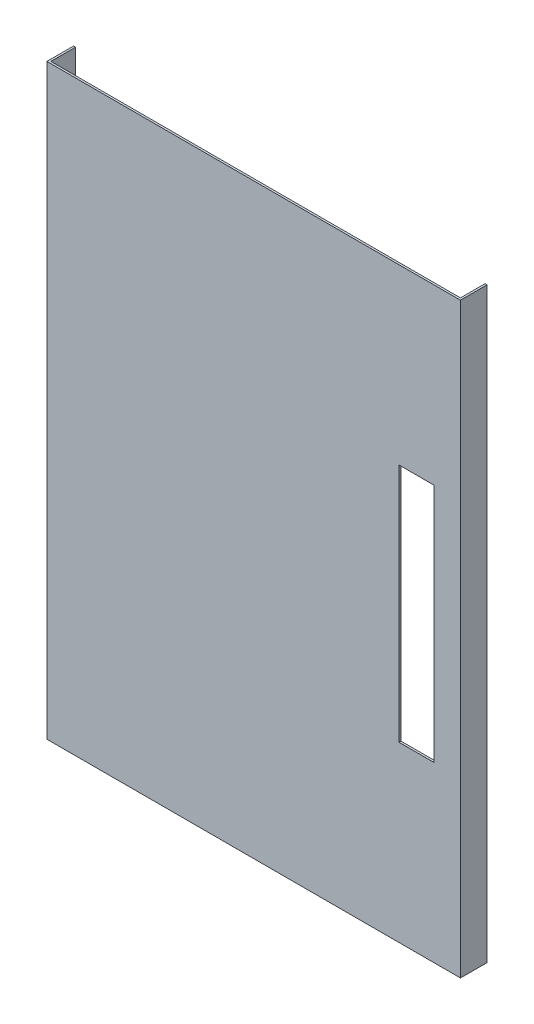
ISO-10303-21;
HEADER;
FILE_DESCRIPTION(('STEP AP214'),'2;1');
FILE_NAME('part.step','',(''),(''),'','','');
FILE_SCHEMA(('AUTOMOTIVE_DESIGN { 1 0 10303 214 1 1 1 1 }'));
ENDSEC;
DATA;
#1=APPLICATION_CONTEXT('core data for automotive mechanical design processes');
#2=APPLICATION_PROTOCOL_DEFINITION('international standard','automotive_design',2000,#1);
#3=PRODUCT_CONTEXT('',#1,'mechanical');
#4=PRODUCT('Part','Part','',(#3));
#5=PRODUCT_RELATED_PRODUCT_CATEGORY('part','',(#4));
#6=PRODUCT_DEFINITION_FORMATION('','',#4);
#7=PRODUCT_DEFINITION_CONTEXT('part definition',#1,'design');
#8=PRODUCT_DEFINITION('design','',#6,#7);
#9=PRODUCT_DEFINITION_SHAPE('','',#8);
#10=(LENGTH_UNIT() NAMED_UNIT(*) SI_UNIT(.MILLI.,.METRE.));
#11=(NAMED_UNIT(*) PLANE_ANGLE_UNIT() SI_UNIT($,.RADIAN.));
#12=(NAMED_UNIT(*) SI_UNIT($,.STERADIAN.) SOLID_ANGLE_UNIT());
#13=UNCERTAINTY_MEASURE_WITH_UNIT(LENGTH_MEASURE(1.E-05),#10,'distance_accuracy_value','');
#14=(GEOMETRIC_REPRESENTATION_CONTEXT(3) GLOBAL_UNCERTAINTY_ASSIGNED_CONTEXT((#13)) GLOBAL_UNIT_ASSIGNED_CONTEXT((#10,
#11,#12)) REPRESENTATION_CONTEXT('',''));
#15=CARTESIAN_POINT('',(0.,0.,0.));
#16=DIRECTION('',(0.,0.,1.));
#17=DIRECTION('',(1.,0.,0.));
#18=AXIS2_PLACEMENT_3D('',#15,#16,#17);
#19=CARTESIAN_POINT('',(340.,1780.,40.));
#20=DIRECTION('',(0.,0.,-1.));
#21=DIRECTION('',(-1.,0.,0.));
#22=AXIS2_PLACEMENT_3D('',#19,#20,#21);
#23=PLANE('',#22);
#24=DIRECTION('',(1.,0.,0.));
#25=VECTOR('',#24,1.);
#26=CARTESIAN_POINT('',(340.,1340.,40.));
#27=LINE('',#26,#25);
#28=CARTESIAN_POINT('',(30.,1340.,40.));
#29=VERTEX_POINT('',#28);
#30=CARTESIAN_POINT('',(340.,1340.,40.));
#31=VERTEX_POINT('',#30);
#32=EDGE_CURVE('E141',#29,#31,#27,.T.);
#33=ORIENTED_EDGE('',*,*,#32,.T.);
#34=DIRECTION('',(0.,-1.,0.));
#35=VECTOR('',#34,1.);
#36=CARTESIAN_POINT('',(340.,1780.,40.));
#37=LINE('',#36,#35);
#38=CARTESIAN_POINT('',(340.,1780.,40.));
#39=VERTEX_POINT('',#38);
#40=EDGE_CURVE('E200',#39,#31,#37,.T.);
#41=ORIENTED_EDGE('',*,*,#40,.F.);
#42=DIRECTION('',(1.,0.,0.));
#43=VECTOR('',#42,1.);
#44=CARTESIAN_POINT('',(340.,1780.,40.));
#45=LINE('',#44,#43);
#46=CARTESIAN_POINT('',(30.,1780.,40.));
#47=VERTEX_POINT('',#46);
#48=EDGE_CURVE('E149',#47,#39,#45,.T.);
#49=ORIENTED_EDGE('',*,*,#48,.F.);
#50=DIRECTION('',(0.,-1.,0.));
#51=VECTOR('',#50,1.);
#52=CARTESIAN_POINT('',(30.,1780.,40.));
#53=LINE('',#52,#51);
#54=EDGE_CURVE('E166',#47,#29,#53,.T.);
#55=ORIENTED_EDGE('',*,*,#54,.T.);
#56=EDGE_LOOP('',(#33,#41,#49,#55));
#57=FACE_BOUND('',#56,.T.);
#58=DIRECTION('',(0.,-1.,0.));
#59=VECTOR('',#58,1.);
#60=CARTESIAN_POINT('',(294.,1780.,40.));
#61=LINE('',#60,#59);
#62=CARTESIAN_POINT('',(294.,1650.,40.));
#63=VERTEX_POINT('',#62);
#64=CARTESIAN_POINT('',(294.,1470.,40.));
#65=VERTEX_POINT('',#64);
#66=EDGE_CURVE('E134',#63,#65,#61,.T.);
#67=ORIENTED_EDGE('',*,*,#66,.F.);
#68=DIRECTION('',(-1.,0.,0.));
#69=VECTOR('',#68,1.);
#70=CARTESIAN_POINT('',(340.,1650.,40.));
#71=LINE('',#70,#69);
#72=CARTESIAN_POINT('',(320.,1650.,40.));
#73=VERTEX_POINT('',#72);
#74=EDGE_CURVE('E123',#73,#63,#71,.T.);
#75=ORIENTED_EDGE('',*,*,#74,.F.);
#76=DIRECTION('',(0.,1.,0.));
#77=VECTOR('',#76,1.);
#78=CARTESIAN_POINT('',(320.,1780.,40.));
#79=LINE('',#78,#77);
#80=CARTESIAN_POINT('',(320.,1470.,40.));
#81=VERTEX_POINT('',#80);
#82=EDGE_CURVE('E128',#81,#73,#79,.T.);
#83=ORIENTED_EDGE('',*,*,#82,.F.);
#84=DIRECTION('',(1.,0.,0.));
#85=VECTOR('',#84,1.);
#86=CARTESIAN_POINT('',(340.,1470.,40.));
#87=LINE('',#86,#85);
#88=EDGE_CURVE('E140',#65,#81,#87,.T.);
#89=ORIENTED_EDGE('',*,*,#88,.F.);
#90=EDGE_LOOP('',(#67,#75,#83,#89));
#91=FACE_BOUND('',#90,.T.);
#92=ADVANCED_FACE('F39',(#57,#91),#23,.F.);
#93=CARTESIAN_POINT('',(31.5,1780.,38.5));
#94=DIRECTION('',(0.,0.,1.));
#95=DIRECTION('',(1.,0.,0.));
#96=AXIS2_PLACEMENT_3D('',#93,#94,#95);
#97=PLANE('',#96);
#98=DIRECTION('',(-1.,0.,0.));
#99=VECTOR('',#98,1.);
#100=CARTESIAN_POINT('',(31.5,1340.,38.5));
#101=LINE('',#100,#99);
#102=CARTESIAN_POINT('',(338.5,1340.,38.5));
#103=VERTEX_POINT('',#102);
#104=CARTESIAN_POINT('',(31.5,1340.,38.5));
#105=VERTEX_POINT('',#104);
#106=EDGE_CURVE('E173',#103,#105,#101,.T.);
#107=ORIENTED_EDGE('',*,*,#106,.T.);
#108=DIRECTION('',(0.,-1.,0.));
#109=VECTOR('',#108,1.);
#110=CARTESIAN_POINT('',(31.5,1780.,38.5));
#111=LINE('',#110,#109);
#112=CARTESIAN_POINT('',(31.5,1780.,38.5));
#113=VERTEX_POINT('',#112);
#114=EDGE_CURVE('E188',#113,#105,#111,.T.);
#115=ORIENTED_EDGE('',*,*,#114,.F.);
#116=DIRECTION('',(-1.,0.,0.));
#117=VECTOR('',#116,1.);
#118=CARTESIAN_POINT('',(31.5,1780.,38.5));
#119=LINE('',#118,#117);
#120=CARTESIAN_POINT('',(338.5,1780.,38.5));
#121=VERTEX_POINT('',#120);
#122=EDGE_CURVE('E159',#121,#113,#119,.T.);
#123=ORIENTED_EDGE('',*,*,#122,.F.);
#124=DIRECTION('',(0.,-1.,0.));
#125=VECTOR('',#124,1.);
#126=CARTESIAN_POINT('',(338.5,1780.,38.5));
#127=LINE('',#126,#125);
#128=EDGE_CURVE('E191',#121,#103,#127,.T.);
#129=ORIENTED_EDGE('',*,*,#128,.T.);
#130=EDGE_LOOP('',(#107,#115,#123,#129));
#131=FACE_BOUND('',#130,.T.);
#132=DIRECTION('',(0.,1.,0.));
#133=VECTOR('',#132,1.);
#134=CARTESIAN_POINT('',(294.,1780.,38.5));
#135=LINE('',#134,#133);
#136=CARTESIAN_POINT('',(294.,1470.,38.5));
#137=VERTEX_POINT('',#136);
#138=CARTESIAN_POINT('',(294.,1650.,38.5));
#139=VERTEX_POINT('',#138);
#140=EDGE_CURVE('E11',#137,#139,#135,.T.);
#141=ORIENTED_EDGE('',*,*,#140,.F.);
#142=DIRECTION('',(-1.,0.,0.));
#143=VECTOR('',#142,1.);
#144=CARTESIAN_POINT('',(31.5,1470.,38.5));
#145=LINE('',#144,#143);
#146=CARTESIAN_POINT('',(320.,1470.,38.5));
#147=VERTEX_POINT('',#146);
#148=EDGE_CURVE('E46',#147,#137,#145,.T.);
#149=ORIENTED_EDGE('',*,*,#148,.F.);
#150=DIRECTION('',(0.,-1.,0.));
#151=VECTOR('',#150,1.);
#152=CARTESIAN_POINT('',(320.,1780.,38.5));
#153=LINE('',#152,#151);
#154=CARTESIAN_POINT('',(320.,1650.,38.5));
#155=VERTEX_POINT('',#154);
#156=EDGE_CURVE('E205',#155,#147,#153,.T.);
#157=ORIENTED_EDGE('',*,*,#156,.F.);
#158=DIRECTION('',(1.,0.,0.));
#159=VECTOR('',#158,1.);
#160=CARTESIAN_POINT('',(31.5,1650.,38.5));
#161=LINE('',#160,#159);
#162=EDGE_CURVE('E203',#139,#155,#161,.T.);
#163=ORIENTED_EDGE('',*,*,#162,.F.);
#164=EDGE_LOOP('',(#141,#149,#157,#163));
#165=FACE_BOUND('',#164,.T.);
#166=ADVANCED_FACE('F215',(#131,#165),#97,.F.);
#167=CARTESIAN_POINT('',(340.,1780.,20.));
#168=DIRECTION('',(-1.,0.,0.));
#169=DIRECTION('',(0.,0.,1.));
#170=AXIS2_PLACEMENT_3D('',#167,#168,#169);
#171=PLANE('',#170);
#172=DIRECTION('',(0.,0.,-1.));
#173=VECTOR('',#172,1.);
#174=CARTESIAN_POINT('',(340.,1340.,20.));
#175=LINE('',#174,#173);
#176=CARTESIAN_POINT('',(340.,1340.,20.));
#177=VERTEX_POINT('',#176);
#178=EDGE_CURVE('E144',#31,#177,#175,.T.);
#179=ORIENTED_EDGE('',*,*,#178,.T.);
#180=DIRECTION('',(0.,-1.,0.));
#181=VECTOR('',#180,1.);
#182=CARTESIAN_POINT('',(340.,1780.,20.));
#183=LINE('',#182,#181);
#184=CARTESIAN_POINT('',(340.,1780.,20.));
#185=VERTEX_POINT('',#184);
#186=EDGE_CURVE('E197',#185,#177,#183,.T.);
#187=ORIENTED_EDGE('',*,*,#186,.F.);
#188=DIRECTION('',(0.,0.,-1.));
#189=VECTOR('',#188,1.);
#190=CARTESIAN_POINT('',(340.,1780.,20.));
#191=LINE('',#190,#189);
#192=EDGE_CURVE('E152',#39,#185,#191,.T.);
#193=ORIENTED_EDGE('',*,*,#192,.F.);
#194=ORIENTED_EDGE('',*,*,#40,.T.);
#195=EDGE_LOOP('',(#179,#187,#193,#194));
#196=FACE_BOUND('',#195,.T.);
#197=ADVANCED_FACE('F234',(#196),#171,.F.);
#198=CARTESIAN_POINT('',(338.5,1780.,20.));
#199=DIRECTION('',(0.,0.,1.));
#200=DIRECTION('',(1.,0.,0.));
#201=AXIS2_PLACEMENT_3D('',#198,#199,#200);
#202=PLANE('',#201);
#203=DIRECTION('',(-1.,0.,0.));
#204=VECTOR('',#203,1.);
#205=CARTESIAN_POINT('',(338.5,1340.,20.));
#206=LINE('',#205,#204);
#207=CARTESIAN_POINT('',(338.5,1340.,20.));
#208=VERTEX_POINT('',#207);
#209=EDGE_CURVE('E169',#177,#208,#206,.T.);
#210=ORIENTED_EDGE('',*,*,#209,.T.);
#211=DIRECTION('',(0.,-1.,0.));
#212=VECTOR('',#211,1.);
#213=CARTESIAN_POINT('',(338.5,1780.,20.));
#214=LINE('',#213,#212);
#215=CARTESIAN_POINT('',(338.5,1780.,20.));
#216=VERTEX_POINT('',#215);
#217=EDGE_CURVE('E194',#216,#208,#214,.T.);
#218=ORIENTED_EDGE('',*,*,#217,.F.);
#219=DIRECTION('',(-1.,0.,0.));
#220=VECTOR('',#219,1.);
#221=CARTESIAN_POINT('',(338.5,1780.,20.));
#222=LINE('',#221,#220);
#223=EDGE_CURVE('E155',#185,#216,#222,.T.);
#224=ORIENTED_EDGE('',*,*,#223,.F.);
#225=ORIENTED_EDGE('',*,*,#186,.T.);
#226=EDGE_LOOP('',(#210,#218,#224,#225));
#227=FACE_BOUND('',#226,.T.);
#228=ADVANCED_FACE('F273',(#227),#202,.F.);
#229=CARTESIAN_POINT('',(338.5,1780.,38.5));
#230=DIRECTION('',(1.,0.,0.));
#231=DIRECTION('',(0.,0.,-1.));
#232=AXIS2_PLACEMENT_3D('',#229,#230,#231);
#233=PLANE('',#232);
#234=DIRECTION('',(0.,0.,1.));
#235=VECTOR('',#234,1.);
#236=CARTESIAN_POINT('',(338.5,1340.,38.5));
#237=LINE('',#236,#235);
#238=EDGE_CURVE('E171',#208,#103,#237,.T.);
#239=ORIENTED_EDGE('',*,*,#238,.T.);
#240=ORIENTED_EDGE('',*,*,#128,.F.);
#241=DIRECTION('',(0.,0.,1.));
#242=VECTOR('',#241,1.);
#243=CARTESIAN_POINT('',(338.5,1780.,38.5));
#244=LINE('',#243,#242);
#245=EDGE_CURVE('E157',#216,#121,#244,.T.);
#246=ORIENTED_EDGE('',*,*,#245,.F.);
#247=ORIENTED_EDGE('',*,*,#217,.T.);
#248=EDGE_LOOP('',(#239,#240,#246,#247));
#249=FACE_BOUND('',#248,.T.);
#250=ADVANCED_FACE('F270',(#249),#233,.F.);
#251=CARTESIAN_POINT('',(31.5,1780.,20.));
#252=DIRECTION('',(-1.,0.,0.));
#253=DIRECTION('',(0.,0.,1.));
#254=AXIS2_PLACEMENT_3D('',#251,#252,#253);
#255=PLANE('',#254);
#256=DIRECTION('',(0.,0.,-1.));
#257=VECTOR('',#256,1.);
#258=CARTESIAN_POINT('',(31.5,1340.,20.));
#259=LINE('',#258,#257);
#260=CARTESIAN_POINT('',(31.5,1340.,20.));
#261=VERTEX_POINT('',#260);
#262=EDGE_CURVE('E175',#105,#261,#259,.T.);
#263=ORIENTED_EDGE('',*,*,#262,.T.);
#264=DIRECTION('',(0.,-1.,0.));
#265=VECTOR('',#264,1.);
#266=CARTESIAN_POINT('',(31.5,1780.,20.));
#267=LINE('',#266,#265);
#268=CARTESIAN_POINT('',(31.5,1780.,20.));
#269=VERTEX_POINT('',#268);
#270=EDGE_CURVE('E185',#269,#261,#267,.T.);
#271=ORIENTED_EDGE('',*,*,#270,.F.);
#272=DIRECTION('',(0.,0.,-1.));
#273=VECTOR('',#272,1.);
#274=CARTESIAN_POINT('',(31.5,1780.,20.));
#275=LINE('',#274,#273);
#276=EDGE_CURVE('E161',#113,#269,#275,.T.);
#277=ORIENTED_EDGE('',*,*,#276,.F.);
#278=ORIENTED_EDGE('',*,*,#114,.T.);
#279=EDGE_LOOP('',(#263,#271,#277,#278));
#280=FACE_BOUND('',#279,.T.);
#281=ADVANCED_FACE('F263',(#280),#255,.F.);
#282=CARTESIAN_POINT('',(30.,1780.,20.));
#283=DIRECTION('',(0.,0.,1.));
#284=DIRECTION('',(1.,0.,0.));
#285=AXIS2_PLACEMENT_3D('',#282,#283,#284);
#286=PLANE('',#285);
#287=DIRECTION('',(-1.,0.,0.));
#288=VECTOR('',#287,1.);
#289=CARTESIAN_POINT('',(30.,1340.,20.));
#290=LINE('',#289,#288);
#291=CARTESIAN_POINT('',(30.,1340.,20.));
#292=VERTEX_POINT('',#291);
#293=EDGE_CURVE('E177',#261,#292,#290,.T.);
#294=ORIENTED_EDGE('',*,*,#293,.T.);
#295=DIRECTION('',(0.,-1.,0.));
#296=VECTOR('',#295,1.);
#297=CARTESIAN_POINT('',(30.,1780.,20.));
#298=LINE('',#297,#296);
#299=CARTESIAN_POINT('',(30.,1780.,20.));
#300=VERTEX_POINT('',#299);
#301=EDGE_CURVE('E182',#300,#292,#298,.T.);
#302=ORIENTED_EDGE('',*,*,#301,.F.);
#303=DIRECTION('',(-1.,0.,0.));
#304=VECTOR('',#303,1.);
#305=CARTESIAN_POINT('',(30.,1780.,20.));
#306=LINE('',#305,#304);
#307=EDGE_CURVE('E163',#269,#300,#306,.T.);
#308=ORIENTED_EDGE('',*,*,#307,.F.);
#309=ORIENTED_EDGE('',*,*,#270,.T.);
#310=EDGE_LOOP('',(#294,#302,#308,#309));
#311=FACE_BOUND('',#310,.T.);
#312=ADVANCED_FACE('F258',(#311),#286,.F.);
#313=CARTESIAN_POINT('',(30.,1780.,40.));
#314=DIRECTION('',(1.,0.,0.));
#315=DIRECTION('',(0.,0.,-1.));
#316=AXIS2_PLACEMENT_3D('',#313,#314,#315);
#317=PLANE('',#316);
#318=DIRECTION('',(0.,0.,1.));
#319=VECTOR('',#318,1.);
#320=CARTESIAN_POINT('',(30.,1340.,40.));
#321=LINE('',#320,#319);
#322=EDGE_CURVE('E153',#292,#29,#321,.T.);
#323=ORIENTED_EDGE('',*,*,#322,.T.);
#324=ORIENTED_EDGE('',*,*,#54,.F.);
#325=DIRECTION('',(0.,0.,1.));
#326=VECTOR('',#325,1.);
#327=CARTESIAN_POINT('',(30.,1780.,40.));
#328=LINE('',#327,#326);
#329=EDGE_CURVE('E165',#300,#47,#328,.T.);
#330=ORIENTED_EDGE('',*,*,#329,.F.);
#331=ORIENTED_EDGE('',*,*,#301,.T.);
#332=EDGE_LOOP('',(#323,#324,#330,#331));
#333=FACE_BOUND('',#332,.T.);
#334=ADVANCED_FACE('F256',(#333),#317,.F.);
#335=CARTESIAN_POINT('',(0.,1780.,0.));
#336=DIRECTION('',(0.,-1.,0.));
#337=DIRECTION('',(0.,0.,-1.));
#338=AXIS2_PLACEMENT_3D('',#335,#336,#337);
#339=PLANE('',#338);
#340=ORIENTED_EDGE('',*,*,#48,.T.);
#341=ORIENTED_EDGE('',*,*,#192,.T.);
#342=ORIENTED_EDGE('',*,*,#223,.T.);
#343=ORIENTED_EDGE('',*,*,#245,.T.);
#344=ORIENTED_EDGE('',*,*,#122,.T.);
#345=ORIENTED_EDGE('',*,*,#276,.T.);
#346=ORIENTED_EDGE('',*,*,#307,.T.);
#347=ORIENTED_EDGE('',*,*,#329,.T.);
#348=EDGE_LOOP('',(#340,#341,#342,#343,#344,#345,#346,#347));
#349=FACE_BOUND('',#348,.T.);
#350=ADVANCED_FACE('F251',(#349),#339,.F.);
#351=CARTESIAN_POINT('',(0.,1340.,0.));
#352=DIRECTION('',(0.,-1.,0.));
#353=DIRECTION('',(0.,0.,-1.));
#354=AXIS2_PLACEMENT_3D('',#351,#352,#353);
#355=PLANE('',#354);
#356=ORIENTED_EDGE('',*,*,#32,.F.);
#357=ORIENTED_EDGE('',*,*,#322,.F.);
#358=ORIENTED_EDGE('',*,*,#293,.F.);
#359=ORIENTED_EDGE('',*,*,#262,.F.);
#360=ORIENTED_EDGE('',*,*,#106,.F.);
#361=ORIENTED_EDGE('',*,*,#238,.F.);
#362=ORIENTED_EDGE('',*,*,#209,.F.);
#363=ORIENTED_EDGE('',*,*,#178,.F.);
#364=EDGE_LOOP('',(#356,#357,#358,#359,#360,#361,#362,#363));
#365=FACE_BOUND('',#364,.T.);
#366=ADVANCED_FACE('F243',(#365),#355,.T.);
#367=CARTESIAN_POINT('',(294.,1470.,41.));
#368=DIRECTION('',(1.,0.,0.));
#369=DIRECTION('',(0.,0.,-1.));
#370=AXIS2_PLACEMENT_3D('',#367,#368,#369);
#371=PLANE('',#370);
#372=ORIENTED_EDGE('',*,*,#66,.T.);
#373=DIRECTION('',(0.,0.,-1.));
#374=VECTOR('',#373,1.);
#375=CARTESIAN_POINT('',(294.,1470.,41.));
#376=LINE('',#375,#374);
#377=EDGE_CURVE('E129',#65,#137,#376,.T.);
#378=ORIENTED_EDGE('',*,*,#377,.T.);
#379=ORIENTED_EDGE('',*,*,#140,.T.);
#380=DIRECTION('',(0.,0.,-1.));
#381=VECTOR('',#380,1.);
#382=CARTESIAN_POINT('',(294.,1650.,41.));
#383=LINE('',#382,#381);
#384=EDGE_CURVE('E58',#63,#139,#383,.T.);
#385=ORIENTED_EDGE('',*,*,#384,.F.);
#386=EDGE_LOOP('',(#372,#378,#379,#385));
#387=FACE_BOUND('',#386,.T.);
#388=ADVANCED_FACE('F132',(#387),#371,.T.);
#389=CARTESIAN_POINT('',(294.,1470.,41.));
#390=DIRECTION('',(0.,1.,0.));
#391=DIRECTION('',(0.,0.,1.));
#392=AXIS2_PLACEMENT_3D('',#389,#390,#391);
#393=PLANE('',#392);
#394=ORIENTED_EDGE('',*,*,#88,.T.);
#395=DIRECTION('',(0.,0.,-1.));
#396=VECTOR('',#395,1.);
#397=CARTESIAN_POINT('',(320.,1470.,41.));
#398=LINE('',#397,#396);
#399=EDGE_CURVE('E211',#81,#147,#398,.T.);
#400=ORIENTED_EDGE('',*,*,#399,.T.);
#401=ORIENTED_EDGE('',*,*,#148,.T.);
#402=ORIENTED_EDGE('',*,*,#377,.F.);
#403=EDGE_LOOP('',(#394,#400,#401,#402));
#404=FACE_BOUND('',#403,.T.);
#405=ADVANCED_FACE('F209',(#404),#393,.T.);
#406=CARTESIAN_POINT('',(320.,1470.,41.));
#407=DIRECTION('',(-1.,0.,0.));
#408=DIRECTION('',(0.,0.,1.));
#409=AXIS2_PLACEMENT_3D('',#406,#407,#408);
#410=PLANE('',#409);
#411=ORIENTED_EDGE('',*,*,#82,.T.);
#412=DIRECTION('',(0.,0.,-1.));
#413=VECTOR('',#412,1.);
#414=CARTESIAN_POINT('',(320.,1650.,41.));
#415=LINE('',#414,#413);
#416=EDGE_CURVE('E53',#73,#155,#415,.T.);
#417=ORIENTED_EDGE('',*,*,#416,.T.);
#418=ORIENTED_EDGE('',*,*,#156,.T.);
#419=ORIENTED_EDGE('',*,*,#399,.F.);
#420=EDGE_LOOP('',(#411,#417,#418,#419));
#421=FACE_BOUND('',#420,.T.);
#422=ADVANCED_FACE('F217',(#421),#410,.T.);
#423=CARTESIAN_POINT('',(294.,1650.,41.));
#424=DIRECTION('',(0.,-1.,0.));
#425=DIRECTION('',(0.,0.,-1.));
#426=AXIS2_PLACEMENT_3D('',#423,#424,#425);
#427=PLANE('',#426);
#428=ORIENTED_EDGE('',*,*,#74,.T.);
#429=ORIENTED_EDGE('',*,*,#384,.T.);
#430=ORIENTED_EDGE('',*,*,#162,.T.);
#431=ORIENTED_EDGE('',*,*,#416,.F.);
#432=EDGE_LOOP('',(#428,#429,#430,#431));
#433=FACE_BOUND('',#432,.T.);
#434=ADVANCED_FACE('F124',(#433),#427,.T.);
#435=CLOSED_SHELL('',(#92,#166,#197,#228,#250,#281,#312,#334,#350,#366,#388,#405,#422,#434));
#436=MANIFOLD_SOLID_BREP('B2',#435);
#437=ADVANCED_BREP_SHAPE_REPRESENTATION('',(#18,#436),#14);
#438=SHAPE_DEFINITION_REPRESENTATION(#9,#437);
ENDSEC;
END-ISO-10303-21;
